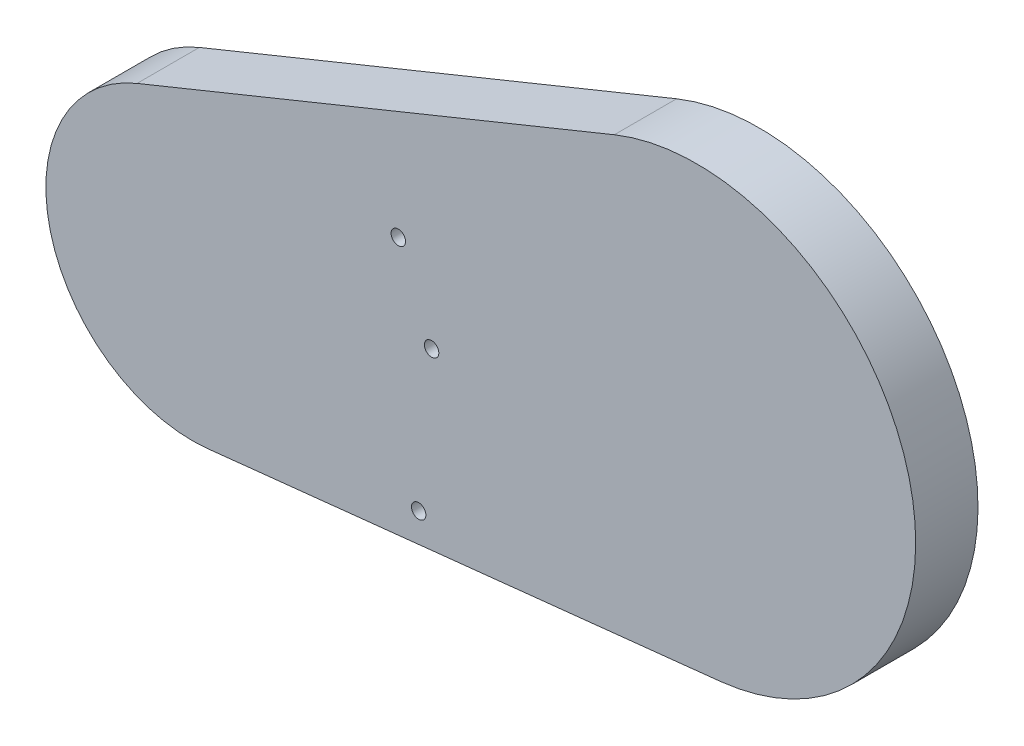
ISO-10303-21;
HEADER;
FILE_DESCRIPTION(('STEP AP214'),'2;1');
FILE_NAME('part.step','',(''),(''),'','','');
FILE_SCHEMA(('AUTOMOTIVE_DESIGN { 1 0 10303 214 1 1 1 1 }'));
ENDSEC;
DATA;
#1=APPLICATION_CONTEXT('core data for automotive mechanical design processes');
#2=APPLICATION_PROTOCOL_DEFINITION('international standard','automotive_design',2000,#1);
#3=PRODUCT_CONTEXT('',#1,'mechanical');
#4=PRODUCT('Part','Part','',(#3));
#5=PRODUCT_RELATED_PRODUCT_CATEGORY('part','',(#4));
#6=PRODUCT_DEFINITION_FORMATION('','',#4);
#7=PRODUCT_DEFINITION_CONTEXT('part definition',#1,'design');
#8=PRODUCT_DEFINITION('design','',#6,#7);
#9=PRODUCT_DEFINITION_SHAPE('','',#8);
#10=(LENGTH_UNIT() NAMED_UNIT(*) SI_UNIT(.MILLI.,.METRE.));
#11=(NAMED_UNIT(*) PLANE_ANGLE_UNIT() SI_UNIT($,.RADIAN.));
#12=(NAMED_UNIT(*) SI_UNIT($,.STERADIAN.) SOLID_ANGLE_UNIT());
#13=UNCERTAINTY_MEASURE_WITH_UNIT(LENGTH_MEASURE(1.E-05),#10,'distance_accuracy_value','');
#14=(GEOMETRIC_REPRESENTATION_CONTEXT(3) GLOBAL_UNCERTAINTY_ASSIGNED_CONTEXT((#13)) GLOBAL_UNIT_ASSIGNED_CONTEXT((#10,
#11,#12)) REPRESENTATION_CONTEXT('',''));
#15=CARTESIAN_POINT('',(0.,0.,0.));
#16=DIRECTION('',(0.,0.,1.));
#17=DIRECTION('',(1.,0.,0.));
#18=AXIS2_PLACEMENT_3D('',#15,#16,#17);
#19=CARTESIAN_POINT('',(-222.136686737355,-55.8663132626931,0.));
#20=DIRECTION('',(0.,0.,1.));
#21=DIRECTION('',(1.,0.,0.));
#22=AXIS2_PLACEMENT_3D('',#19,#20,#21);
#23=PLANE('',#22);
#24=CARTESIAN_POINT('',(-131.386504710328,2.59398918316859,0.));
#25=DIRECTION('',(0.,0.,1.));
#26=DIRECTION('',(1.,0.,0.));
#27=AXIS2_PLACEMENT_3D('',#24,#25,#26);
#28=CIRCLE('',#27,3.175);
#29=CARTESIAN_POINT('',(-128.211504710328,2.59398918316859,0.));
#30=VERTEX_POINT('',#29);
#31=EDGE_CURVE('E116',#30,#30,#28,.T.);
#32=ORIENTED_EDGE('',*,*,#31,.T.);
#33=EDGE_LOOP('',(#32));
#34=FACE_BOUND('',#33,.T.);
#35=CARTESIAN_POINT('',(-131.386504710328,2.59398918316859,0.));
#36=DIRECTION('',(0.,0.,1.));
#37=DIRECTION('',(1.,0.,0.));
#38=AXIS2_PLACEMENT_3D('',#35,#36,#37);
#39=CIRCLE('',#38,5.715);
#40=CARTESIAN_POINT('',(-125.671504710328,2.59398918316859,0.));
#41=VERTEX_POINT('',#40);
#42=EDGE_CURVE('E218',#41,#41,#39,.T.);
#43=ORIENTED_EDGE('',*,*,#42,.F.);
#44=EDGE_LOOP('',(#43));
#45=FACE_BOUND('',#44,.T.);
#46=ADVANCED_FACE('F39',(#34,#45),#23,.F.);
#47=CARTESIAN_POINT('',(-116.729233003734,-32.5753021769855,0.));
#48=DIRECTION('',(0.,0.,1.));
#49=DIRECTION('',(1.,0.,0.));
#50=AXIS2_PLACEMENT_3D('',#47,#48,#49);
#51=CIRCLE('',#50,3.17499999999997);
#52=CARTESIAN_POINT('',(-113.554233003734,-32.5753021769855,0.));
#53=VERTEX_POINT('',#52);
#54=EDGE_CURVE('E119',#53,#53,#51,.T.);
#55=ORIENTED_EDGE('',*,*,#54,.T.);
#56=EDGE_LOOP('',(#55));
#57=FACE_BOUND('',#56,.T.);
#58=CARTESIAN_POINT('',(-116.729233003734,-32.5753021769855,0.));
#59=DIRECTION('',(0.,0.,1.));
#60=DIRECTION('',(1.,0.,0.));
#61=AXIS2_PLACEMENT_3D('',#58,#59,#60);
#62=CIRCLE('',#61,5.71499999999997);
#63=CARTESIAN_POINT('',(-111.014233003734,-32.5753021769855,0.));
#64=VERTEX_POINT('',#63);
#65=EDGE_CURVE('E220',#64,#64,#62,.T.);
#66=ORIENTED_EDGE('',*,*,#65,.F.);
#67=EDGE_LOOP('',(#66));
#68=FACE_BOUND('',#67,.T.);
#69=ADVANCED_FACE('F231',(#57,#68),#23,.F.);
#70=CARTESIAN_POINT('',(-122.419021559769,-97.2134987960628,0.));
#71=DIRECTION('',(0.,0.,1.));
#72=DIRECTION('',(1.,0.,0.));
#73=AXIS2_PLACEMENT_3D('',#70,#71,#72);
#74=CIRCLE('',#73,3.17499999999997);
#75=CARTESIAN_POINT('',(-119.244021559769,-97.2134987960628,0.));
#76=VERTEX_POINT('',#75);
#77=EDGE_CURVE('E123',#76,#76,#74,.T.);
#78=ORIENTED_EDGE('',*,*,#77,.T.);
#79=EDGE_LOOP('',(#78));
#80=FACE_BOUND('',#79,.T.);
#81=CARTESIAN_POINT('',(-122.419021559769,-97.2134987960628,0.));
#82=DIRECTION('',(0.,0.,1.));
#83=DIRECTION('',(1.,0.,0.));
#84=AXIS2_PLACEMENT_3D('',#81,#82,#83);
#85=CIRCLE('',#84,5.71499999999997);
#86=CARTESIAN_POINT('',(-116.704021559769,-97.2134987960628,0.));
#87=VERTEX_POINT('',#86);
#88=EDGE_CURVE('E145',#87,#87,#85,.T.);
#89=ORIENTED_EDGE('',*,*,#88,.F.);
#90=EDGE_LOOP('',(#89));
#91=FACE_BOUND('',#90,.T.);
#92=ADVANCED_FACE('F229',(#80,#91),#23,.F.);
#93=DIRECTION('',(-0.926278440874321,-0.376839820044852,0.));
#94=VECTOR('',#93,1.);
#95=CARTESIAN_POINT('',(-245.448840445252,1.4353418209012,0.));
#96=LINE('',#95,#94);
#97=CARTESIAN_POINT('',(-35.3567786970669,86.9075402964568,0.));
#98=VERTEX_POINT('',#97);
#99=CARTESIAN_POINT('',(-245.448840445252,1.43534182090119,0.));
#100=VERTEX_POINT('',#99);
#101=EDGE_CURVE('E202',#98,#100,#96,.T.);
#102=ORIENTED_EDGE('',*,*,#101,.T.);
#103=CARTESIAN_POINT('',(-222.136686737355,-55.8663132626931,0.));
#104=DIRECTION('',(0.,0.,1.));
#105=DIRECTION('',(1.,0.,0.));
#106=AXIS2_PLACEMENT_3D('',#103,#104,#105);
#107=CIRCLE('',#106,61.8622355384919);
#108=CARTESIAN_POINT('',(-215.567656663318,-117.378783784582,0.));
#109=VERTEX_POINT('',#108);
#110=EDGE_CURVE('E193',#100,#109,#107,.T.);
#111=ORIENTED_EDGE('',*,*,#110,.T.);
#112=DIRECTION('',(0.994346065680323,0.106188048602762,0.));
#113=VECTOR('',#112,1.);
#114=CARTESIAN_POINT('',(9.96303239470388,-93.2939459220999,0.));
#115=LINE('',#114,#113);
#116=CARTESIAN_POINT('',(9.96303239470389,-93.2939459220999,0.));
#117=VERTEX_POINT('',#116);
#118=EDGE_CURVE('E187',#109,#117,#115,.T.);
#119=ORIENTED_EDGE('',*,*,#118,.T.);
#120=CARTESIAN_POINT('',(0.,0.,0.));
#121=DIRECTION('',(0.,0.,1.));
#122=DIRECTION('',(1.,0.,0.));
#123=AXIS2_PLACEMENT_3D('',#120,#121,#122);
#124=CIRCLE('',#123,93.8244230475926);
#125=EDGE_CURVE('E56',#117,#98,#124,.T.);
#126=ORIENTED_EDGE('',*,*,#125,.T.);
#127=EDGE_LOOP('',(#102,#111,#119,#126));
#128=FACE_BOUND('',#127,.T.);
#129=CARTESIAN_POINT('',(-222.136686737355,-55.8663132626931,0.));
#130=DIRECTION('',(0.,0.,1.));
#131=DIRECTION('',(1.,0.,0.));
#132=AXIS2_PLACEMENT_3D('',#129,#130,#131);
#133=CIRCLE('',#132,64.4022355384919);
#134=CARTESIAN_POINT('',(-246.406013588166,3.78808906072198,0.));
#135=VERTEX_POINT('',#134);
#136=CARTESIAN_POINT('',(-215.297939019867,-119.90442279141,0.));
#137=VERTEX_POINT('',#136);
#138=EDGE_CURVE('E102',#135,#137,#133,.T.);
#139=ORIENTED_EDGE('',*,*,#138,.F.);
#140=DIRECTION('',(-0.926278440874321,-0.376839820044852,0.));
#141=VECTOR('',#140,1.);
#142=CARTESIAN_POINT('',(-246.406013588166,3.78808906072198,0.));
#143=LINE('',#142,#141);
#144=CARTESIAN_POINT('',(-36.3139518399808,89.2602875362775,0.));
#145=VERTEX_POINT('',#144);
#146=EDGE_CURVE('E129',#145,#135,#143,.T.);
#147=ORIENTED_EDGE('',*,*,#146,.F.);
#148=CARTESIAN_POINT('',(0.,0.,0.));
#149=DIRECTION('',(0.,0.,1.));
#150=DIRECTION('',(1.,0.,0.));
#151=AXIS2_PLACEMENT_3D('',#148,#149,#150);
#152=CIRCLE('',#151,96.3644230475926);
#153=CARTESIAN_POINT('',(10.2327500381549,-95.8195849289279,0.));
#154=VERTEX_POINT('',#153);
#155=EDGE_CURVE('E104',#154,#145,#152,.T.);
#156=ORIENTED_EDGE('',*,*,#155,.F.);
#157=DIRECTION('',(0.994346065680323,0.106188048602762,0.));
#158=VECTOR('',#157,1.);
#159=CARTESIAN_POINT('',(10.2327500381549,-95.8195849289279,0.));
#160=LINE('',#159,#158);
#161=EDGE_CURVE('E92',#137,#154,#160,.T.);
#162=ORIENTED_EDGE('',*,*,#161,.F.);
#163=EDGE_LOOP('',(#139,#147,#156,#162));
#164=FACE_BOUND('',#163,.T.);
#165=ADVANCED_FACE('F100',(#128,#164),#23,.F.);
#166=CARTESIAN_POINT('',(-222.136686737355,-55.8663132626931,480.07228683974));
#167=DIRECTION('',(0.,0.,-1.));
#168=DIRECTION('',(-1.,0.,0.));
#169=AXIS2_PLACEMENT_3D('',#166,#167,#168);
#170=CYLINDRICAL_SURFACE('',#169,64.4022355384919);
#171=DIRECTION('',(0.,0.,-1.));
#172=VECTOR('',#171,1.);
#173=CARTESIAN_POINT('',(-215.297939019867,-119.90442279141,480.07228683974));
#174=LINE('',#173,#172);
#175=CARTESIAN_POINT('',(-215.297939019867,-119.90442279141,27.4349999999975));
#176=VERTEX_POINT('',#175);
#177=EDGE_CURVE('E88',#176,#137,#174,.T.);
#178=ORIENTED_EDGE('',*,*,#177,.F.);
#179=CARTESIAN_POINT('',(-222.136686737355,-55.8663132626931,27.4349999999975));
#180=DIRECTION('',(0.,0.,-1.));
#181=DIRECTION('',(-1.,0.,0.));
#182=AXIS2_PLACEMENT_3D('',#179,#180,#181);
#183=CIRCLE('',#182,64.4022355384919);
#184=CARTESIAN_POINT('',(-246.406013588166,3.78808906072198,27.4349999999975));
#185=VERTEX_POINT('',#184);
#186=EDGE_CURVE('E65',#176,#185,#183,.T.);
#187=ORIENTED_EDGE('',*,*,#186,.T.);
#188=DIRECTION('',(0.,0.,-1.));
#189=VECTOR('',#188,1.);
#190=CARTESIAN_POINT('',(-246.406013588166,3.78808906072198,480.07228683974));
#191=LINE('',#190,#189);
#192=EDGE_CURVE('E109',#185,#135,#191,.T.);
#193=ORIENTED_EDGE('',*,*,#192,.T.);
#194=ORIENTED_EDGE('',*,*,#138,.T.);
#195=EDGE_LOOP('',(#178,#187,#193,#194));
#196=FACE_BOUND('',#195,.T.);
#197=ADVANCED_FACE('F107',(#196),#170,.T.);
#198=CARTESIAN_POINT('',(10.2327500381549,-95.8195849289279,480.07228683974));
#199=DIRECTION('',(-0.106188048602762,0.994346065680323,0.));
#200=DIRECTION('',(-0.994346065680323,-0.106188048602762,0.));
#201=AXIS2_PLACEMENT_3D('',#198,#199,#200);
#202=PLANE('',#201);
#203=DIRECTION('',(0.,0.,-1.));
#204=VECTOR('',#203,1.);
#205=CARTESIAN_POINT('',(10.2327500381549,-95.8195849289279,480.07228683974));
#206=LINE('',#205,#204);
#207=CARTESIAN_POINT('',(10.2327500381549,-95.8195849289279,27.4349999999975));
#208=VERTEX_POINT('',#207);
#209=EDGE_CURVE('E126',#208,#154,#206,.T.);
#210=ORIENTED_EDGE('',*,*,#209,.F.);
#211=DIRECTION('',(-0.994346065680323,-0.106188048602762,0.));
#212=VECTOR('',#211,1.);
#213=CARTESIAN_POINT('',(10.2327500381549,-95.8195849289279,27.4349999999975));
#214=LINE('',#213,#212);
#215=EDGE_CURVE('E94',#208,#176,#214,.T.);
#216=ORIENTED_EDGE('',*,*,#215,.T.);
#217=ORIENTED_EDGE('',*,*,#177,.T.);
#218=ORIENTED_EDGE('',*,*,#161,.T.);
#219=EDGE_LOOP('',(#210,#216,#217,#218));
#220=FACE_BOUND('',#219,.T.);
#221=ADVANCED_FACE('F91',(#220),#202,.F.);
#222=CARTESIAN_POINT('',(0.,0.,480.07228683974));
#223=DIRECTION('',(0.,0.,-1.));
#224=DIRECTION('',(-1.,0.,0.));
#225=AXIS2_PLACEMENT_3D('',#222,#223,#224);
#226=CYLINDRICAL_SURFACE('',#225,96.3644230475926);
#227=DIRECTION('',(0.,0.,-1.));
#228=VECTOR('',#227,1.);
#229=CARTESIAN_POINT('',(-36.3139518399808,89.2602875362775,480.07228683974));
#230=LINE('',#229,#228);
#231=CARTESIAN_POINT('',(-36.3139518399808,89.2602875362775,27.4349999999975));
#232=VERTEX_POINT('',#231);
#233=EDGE_CURVE('E128',#232,#145,#230,.T.);
#234=ORIENTED_EDGE('',*,*,#233,.F.);
#235=CARTESIAN_POINT('',(0.,0.,27.4349999999975));
#236=DIRECTION('',(0.,0.,-1.));
#237=DIRECTION('',(-1.,0.,0.));
#238=AXIS2_PLACEMENT_3D('',#235,#236,#237);
#239=CIRCLE('',#238,96.3644230475926);
#240=EDGE_CURVE('E105',#232,#208,#239,.T.);
#241=ORIENTED_EDGE('',*,*,#240,.T.);
#242=ORIENTED_EDGE('',*,*,#209,.T.);
#243=ORIENTED_EDGE('',*,*,#155,.T.);
#244=EDGE_LOOP('',(#234,#241,#242,#243));
#245=FACE_BOUND('',#244,.T.);
#246=ADVANCED_FACE('F149',(#245),#226,.T.);
#247=CARTESIAN_POINT('',(-246.406013588166,3.78808906072198,480.07228683974));
#248=DIRECTION('',(0.376839820044852,-0.926278440874321,0.));
#249=DIRECTION('',(0.926278440874321,0.376839820044852,0.));
#250=AXIS2_PLACEMENT_3D('',#247,#248,#249);
#251=PLANE('',#250);
#252=ORIENTED_EDGE('',*,*,#192,.F.);
#253=DIRECTION('',(0.926278440874321,0.376839820044852,0.));
#254=VECTOR('',#253,1.);
#255=CARTESIAN_POINT('',(-246.406013588166,3.78808906072198,27.4349999999975));
#256=LINE('',#255,#254);
#257=EDGE_CURVE('E130',#185,#232,#256,.T.);
#258=ORIENTED_EDGE('',*,*,#257,.T.);
#259=ORIENTED_EDGE('',*,*,#233,.T.);
#260=ORIENTED_EDGE('',*,*,#146,.T.);
#261=EDGE_LOOP('',(#252,#258,#259,#260));
#262=FACE_BOUND('',#261,.T.);
#263=ADVANCED_FACE('F371',(#262),#251,.F.);
#264=CARTESIAN_POINT('',(-131.386504710328,2.59398918316859,480.07228683974));
#265=DIRECTION('',(0.,0.,-1.));
#266=DIRECTION('',(-1.,0.,0.));
#267=AXIS2_PLACEMENT_3D('',#264,#265,#266);
#268=CYLINDRICAL_SURFACE('',#267,3.175);
#269=CARTESIAN_POINT('',(-131.386504710328,2.59398918316859,27.4349999999975));
#270=DIRECTION('',(0.,0.,-1.));
#271=DIRECTION('',(-1.,0.,0.));
#272=AXIS2_PLACEMENT_3D('',#269,#270,#271);
#273=CIRCLE('',#272,3.175);
#274=CARTESIAN_POINT('',(-134.561504710328,2.59398918316859,27.4349999999975));
#275=VERTEX_POINT('',#274);
#276=EDGE_CURVE('E11',#275,#275,#273,.T.);
#277=ORIENTED_EDGE('',*,*,#276,.F.);
#278=EDGE_LOOP('',(#277));
#279=FACE_BOUND('',#278,.T.);
#280=ORIENTED_EDGE('',*,*,#31,.F.);
#281=EDGE_LOOP('',(#280));
#282=FACE_BOUND('',#281,.T.);
#283=ADVANCED_FACE('F361',(#279,#282),#268,.F.);
#284=CARTESIAN_POINT('',(-116.729233003734,-32.5753021769855,480.07228683974));
#285=DIRECTION('',(0.,0.,-1.));
#286=DIRECTION('',(-1.,0.,0.));
#287=AXIS2_PLACEMENT_3D('',#284,#285,#286);
#288=CYLINDRICAL_SURFACE('',#287,3.17499999999997);
#289=CARTESIAN_POINT('',(-116.729233003734,-32.5753021769855,27.4349999999975));
#290=DIRECTION('',(0.,0.,-1.));
#291=DIRECTION('',(-1.,0.,0.));
#292=AXIS2_PLACEMENT_3D('',#289,#290,#291);
#293=CIRCLE('',#292,3.17499999999997);
#294=CARTESIAN_POINT('',(-119.904233003734,-32.5753021769855,27.4349999999975));
#295=VERTEX_POINT('',#294);
#296=EDGE_CURVE('E48',#295,#295,#293,.T.);
#297=ORIENTED_EDGE('',*,*,#296,.F.);
#298=EDGE_LOOP('',(#297));
#299=FACE_BOUND('',#298,.T.);
#300=ORIENTED_EDGE('',*,*,#54,.F.);
#301=EDGE_LOOP('',(#300));
#302=FACE_BOUND('',#301,.T.);
#303=ADVANCED_FACE('F352',(#299,#302),#288,.F.);
#304=CARTESIAN_POINT('',(-122.419021559769,-97.2134987960628,480.07228683974));
#305=DIRECTION('',(0.,0.,-1.));
#306=DIRECTION('',(-1.,0.,0.));
#307=AXIS2_PLACEMENT_3D('',#304,#305,#306);
#308=CYLINDRICAL_SURFACE('',#307,3.17499999999997);
#309=CARTESIAN_POINT('',(-122.419021559769,-97.2134987960628,27.4349999999975));
#310=DIRECTION('',(0.,0.,-1.));
#311=DIRECTION('',(-1.,0.,0.));
#312=AXIS2_PLACEMENT_3D('',#309,#310,#311);
#313=CIRCLE('',#312,3.17499999999997);
#314=CARTESIAN_POINT('',(-125.594021559769,-97.2134987960628,27.4349999999975));
#315=VERTEX_POINT('',#314);
#316=EDGE_CURVE('E43',#315,#315,#313,.T.);
#317=ORIENTED_EDGE('',*,*,#316,.F.);
#318=EDGE_LOOP('',(#317));
#319=FACE_BOUND('',#318,.T.);
#320=ORIENTED_EDGE('',*,*,#77,.F.);
#321=EDGE_LOOP('',(#320));
#322=FACE_BOUND('',#321,.T.);
#323=ADVANCED_FACE('F344',(#319,#322),#308,.F.);
#324=CARTESIAN_POINT('',(0.,0.,27.4349999999976));
#325=DIRECTION('',(0.,0.,-1.));
#326=DIRECTION('',(-1.,0.,0.));
#327=AXIS2_PLACEMENT_3D('',#324,#325,#326);
#328=PLANE('',#327);
#329=ORIENTED_EDGE('',*,*,#316,.T.);
#330=EDGE_LOOP('',(#329));
#331=FACE_BOUND('',#330,.T.);
#332=ORIENTED_EDGE('',*,*,#296,.T.);
#333=EDGE_LOOP('',(#332));
#334=FACE_BOUND('',#333,.T.);
#335=ORIENTED_EDGE('',*,*,#276,.T.);
#336=EDGE_LOOP('',(#335));
#337=FACE_BOUND('',#336,.T.);
#338=ORIENTED_EDGE('',*,*,#215,.F.);
#339=ORIENTED_EDGE('',*,*,#240,.F.);
#340=ORIENTED_EDGE('',*,*,#257,.F.);
#341=ORIENTED_EDGE('',*,*,#186,.F.);
#342=EDGE_LOOP('',(#338,#339,#340,#341));
#343=FACE_BOUND('',#342,.T.);
#344=ADVANCED_FACE('F41',(#331,#334,#337,#343),#328,.F.);
#345=CARTESIAN_POINT('',(-222.136686737355,-55.8663132626931,480.07228683974));
#346=DIRECTION('',(0.,0.,-1.));
#347=DIRECTION('',(-1.,0.,0.));
#348=AXIS2_PLACEMENT_3D('',#345,#346,#347);
#349=CYLINDRICAL_SURFACE('',#348,61.8622355384919);
#350=DIRECTION('',(0.,0.,1.));
#351=VECTOR('',#350,1.);
#352=CARTESIAN_POINT('',(-215.567656663318,-117.378783784582,480.07228683974));
#353=LINE('',#352,#351);
#354=CARTESIAN_POINT('',(-215.567656663318,-117.378783784582,24.8949999999976));
#355=VERTEX_POINT('',#354);
#356=EDGE_CURVE('E176',#355,#109,#353,.F.);
#357=ORIENTED_EDGE('',*,*,#356,.T.);
#358=ORIENTED_EDGE('',*,*,#110,.F.);
#359=DIRECTION('',(0.,0.,-1.));
#360=VECTOR('',#359,1.);
#361=CARTESIAN_POINT('',(-245.448840445252,1.43534182090119,480.07228683974));
#362=LINE('',#361,#360);
#363=CARTESIAN_POINT('',(-245.448840445252,1.43534182090119,24.8949999999976));
#364=VERTEX_POINT('',#363);
#365=EDGE_CURVE('E178',#364,#100,#362,.T.);
#366=ORIENTED_EDGE('',*,*,#365,.F.);
#367=CARTESIAN_POINT('',(-222.136686737355,-55.8663132626931,24.8949999999976));
#368=DIRECTION('',(0.,0.,-1.));
#369=DIRECTION('',(-1.,0.,0.));
#370=AXIS2_PLACEMENT_3D('',#367,#368,#369);
#371=CIRCLE('',#370,61.8622355384919);
#372=EDGE_CURVE('E172',#355,#364,#371,.T.);
#373=ORIENTED_EDGE('',*,*,#372,.F.);
#374=EDGE_LOOP('',(#357,#358,#366,#373));
#375=FACE_BOUND('',#374,.T.);
#376=ADVANCED_FACE('F174',(#375),#349,.F.);
#377=CARTESIAN_POINT('',(9.96303239470388,-93.2939459220999,480.07228683974));
#378=DIRECTION('',(-0.106188048602762,0.994346065680323,0.));
#379=DIRECTION('',(-0.994346065680323,-0.106188048602762,0.));
#380=AXIS2_PLACEMENT_3D('',#377,#378,#379);
#381=PLANE('',#380);
#382=DIRECTION('',(0.,0.,-1.));
#383=VECTOR('',#382,1.);
#384=CARTESIAN_POINT('',(9.96303239470389,-93.2939459220999,480.07228683974));
#385=LINE('',#384,#383);
#386=CARTESIAN_POINT('',(9.96303239470389,-93.2939459220999,24.8949999999976));
#387=VERTEX_POINT('',#386);
#388=EDGE_CURVE('E198',#387,#117,#385,.T.);
#389=ORIENTED_EDGE('',*,*,#388,.T.);
#390=ORIENTED_EDGE('',*,*,#118,.F.);
#391=ORIENTED_EDGE('',*,*,#356,.F.);
#392=DIRECTION('',(-0.994346065680323,-0.106188048602762,0.));
#393=VECTOR('',#392,1.);
#394=CARTESIAN_POINT('',(9.96303239470388,-93.2939459220999,24.8949999999976));
#395=LINE('',#394,#393);
#396=EDGE_CURVE('E185',#387,#355,#395,.T.);
#397=ORIENTED_EDGE('',*,*,#396,.F.);
#398=EDGE_LOOP('',(#389,#390,#391,#397));
#399=FACE_BOUND('',#398,.T.);
#400=ADVANCED_FACE('F184',(#399),#381,.T.);
#401=CARTESIAN_POINT('',(0.,0.,480.07228683974));
#402=DIRECTION('',(0.,0.,-1.));
#403=DIRECTION('',(-1.,0.,0.));
#404=AXIS2_PLACEMENT_3D('',#401,#402,#403);
#405=CYLINDRICAL_SURFACE('',#404,93.8244230475926);
#406=DIRECTION('',(0.,0.,1.));
#407=VECTOR('',#406,1.);
#408=CARTESIAN_POINT('',(-35.3567786970669,86.9075402964568,480.07228683974));
#409=LINE('',#408,#407);
#410=CARTESIAN_POINT('',(-35.3567786970669,86.9075402964568,24.8949999999976));
#411=VERTEX_POINT('',#410);
#412=EDGE_CURVE('E200',#411,#98,#409,.F.);
#413=ORIENTED_EDGE('',*,*,#412,.T.);
#414=ORIENTED_EDGE('',*,*,#125,.F.);
#415=ORIENTED_EDGE('',*,*,#388,.F.);
#416=CARTESIAN_POINT('',(0.,0.,24.8949999999976));
#417=DIRECTION('',(0.,0.,-1.));
#418=DIRECTION('',(-1.,0.,0.));
#419=AXIS2_PLACEMENT_3D('',#416,#417,#418);
#420=CIRCLE('',#419,93.8244230475926);
#421=EDGE_CURVE('E192',#411,#387,#420,.T.);
#422=ORIENTED_EDGE('',*,*,#421,.F.);
#423=EDGE_LOOP('',(#413,#414,#415,#422));
#424=FACE_BOUND('',#423,.T.);
#425=ADVANCED_FACE('F263',(#424),#405,.F.);
#426=CARTESIAN_POINT('',(-245.448840445252,1.4353418209012,480.07228683974));
#427=DIRECTION('',(0.376839820044852,-0.926278440874321,0.));
#428=DIRECTION('',(0.926278440874321,0.376839820044852,0.));
#429=AXIS2_PLACEMENT_3D('',#426,#427,#428);
#430=PLANE('',#429);
#431=ORIENTED_EDGE('',*,*,#365,.T.);
#432=ORIENTED_EDGE('',*,*,#101,.F.);
#433=ORIENTED_EDGE('',*,*,#412,.F.);
#434=DIRECTION('',(0.926278440874321,0.376839820044852,0.));
#435=VECTOR('',#434,1.);
#436=CARTESIAN_POINT('',(-245.448840445252,1.4353418209012,24.8949999999976));
#437=LINE('',#436,#435);
#438=EDGE_CURVE('E203',#364,#411,#437,.T.);
#439=ORIENTED_EDGE('',*,*,#438,.F.);
#440=EDGE_LOOP('',(#431,#432,#433,#439));
#441=FACE_BOUND('',#440,.T.);
#442=ADVANCED_FACE('F254',(#441),#430,.T.);
#443=CARTESIAN_POINT('',(-131.386504710328,2.59398918316859,480.07228683974));
#444=DIRECTION('',(0.,0.,-1.));
#445=DIRECTION('',(-1.,0.,0.));
#446=AXIS2_PLACEMENT_3D('',#443,#444,#445);
#447=CYLINDRICAL_SURFACE('',#446,5.715);
#448=CARTESIAN_POINT('',(-131.386504710328,2.59398918316859,24.8949999999976));
#449=DIRECTION('',(0.,0.,-1.));
#450=DIRECTION('',(-1.,0.,0.));
#451=AXIS2_PLACEMENT_3D('',#448,#449,#450);
#452=CIRCLE('',#451,5.715);
#453=CARTESIAN_POINT('',(-137.101504710328,2.59398918316859,24.8949999999976));
#454=VERTEX_POINT('',#453);
#455=EDGE_CURVE('E120',#454,#454,#452,.T.);
#456=ORIENTED_EDGE('',*,*,#455,.T.);
#457=EDGE_LOOP('',(#456));
#458=FACE_BOUND('',#457,.T.);
#459=ORIENTED_EDGE('',*,*,#42,.T.);
#460=EDGE_LOOP('',(#459));
#461=FACE_BOUND('',#460,.T.);
#462=ADVANCED_FACE('F251',(#458,#461),#447,.T.);
#463=CARTESIAN_POINT('',(-116.729233003734,-32.5753021769855,480.07228683974));
#464=DIRECTION('',(0.,0.,-1.));
#465=DIRECTION('',(-1.,0.,0.));
#466=AXIS2_PLACEMENT_3D('',#463,#464,#465);
#467=CYLINDRICAL_SURFACE('',#466,5.71499999999997);
#468=CARTESIAN_POINT('',(-116.729233003734,-32.5753021769855,24.8949999999976));
#469=DIRECTION('',(0.,0.,-1.));
#470=DIRECTION('',(-1.,0.,0.));
#471=AXIS2_PLACEMENT_3D('',#468,#469,#470);
#472=CIRCLE('',#471,5.71499999999997);
#473=CARTESIAN_POINT('',(-122.444233003734,-32.5753021769855,24.8949999999976));
#474=VERTEX_POINT('',#473);
#475=EDGE_CURVE('E209',#474,#474,#472,.T.);
#476=ORIENTED_EDGE('',*,*,#475,.T.);
#477=EDGE_LOOP('',(#476));
#478=FACE_BOUND('',#477,.T.);
#479=ORIENTED_EDGE('',*,*,#65,.T.);
#480=EDGE_LOOP('',(#479));
#481=FACE_BOUND('',#480,.T.);
#482=ADVANCED_FACE('F253',(#478,#481),#467,.T.);
#483=CARTESIAN_POINT('',(-122.419021559769,-97.2134987960628,480.07228683974));
#484=DIRECTION('',(0.,0.,-1.));
#485=DIRECTION('',(-1.,0.,0.));
#486=AXIS2_PLACEMENT_3D('',#483,#484,#485);
#487=CYLINDRICAL_SURFACE('',#486,5.71499999999997);
#488=CARTESIAN_POINT('',(-122.419021559769,-97.2134987960628,24.8949999999976));
#489=DIRECTION('',(0.,0.,-1.));
#490=DIRECTION('',(-1.,0.,0.));
#491=AXIS2_PLACEMENT_3D('',#488,#489,#490);
#492=CIRCLE('',#491,5.71499999999997);
#493=CARTESIAN_POINT('',(-128.134021559769,-97.2134987960628,24.8949999999976));
#494=VERTEX_POINT('',#493);
#495=EDGE_CURVE('E206',#494,#494,#492,.T.);
#496=ORIENTED_EDGE('',*,*,#495,.T.);
#497=EDGE_LOOP('',(#496));
#498=FACE_BOUND('',#497,.T.);
#499=ORIENTED_EDGE('',*,*,#88,.T.);
#500=EDGE_LOOP('',(#499));
#501=FACE_BOUND('',#500,.T.);
#502=ADVANCED_FACE('F227',(#498,#501),#487,.T.);
#503=CARTESIAN_POINT('',(0.,0.,24.8949999999976));
#504=DIRECTION('',(0.,0.,-1.));
#505=DIRECTION('',(-1.,0.,0.));
#506=AXIS2_PLACEMENT_3D('',#503,#504,#505);
#507=PLANE('',#506);
#508=ORIENTED_EDGE('',*,*,#495,.F.);
#509=EDGE_LOOP('',(#508));
#510=FACE_BOUND('',#509,.T.);
#511=ORIENTED_EDGE('',*,*,#475,.F.);
#512=EDGE_LOOP('',(#511));
#513=FACE_BOUND('',#512,.T.);
#514=ORIENTED_EDGE('',*,*,#455,.F.);
#515=EDGE_LOOP('',(#514));
#516=FACE_BOUND('',#515,.T.);
#517=ORIENTED_EDGE('',*,*,#396,.T.);
#518=ORIENTED_EDGE('',*,*,#372,.T.);
#519=ORIENTED_EDGE('',*,*,#438,.T.);
#520=ORIENTED_EDGE('',*,*,#421,.T.);
#521=EDGE_LOOP('',(#517,#518,#519,#520));
#522=FACE_BOUND('',#521,.T.);
#523=ADVANCED_FACE('F191',(#510,#513,#516,#522),#507,.T.);
#524=CLOSED_SHELL('',(#46,#69,#92,#165,#197,#221,#246,#263,#283,#303,#323,#344,#376,#400,#425,
#442,#462,#482,#502,#523));
#525=MANIFOLD_SOLID_BREP('B2',#524);
#526=ADVANCED_BREP_SHAPE_REPRESENTATION('',(#18,#525),#14);
#527=SHAPE_DEFINITION_REPRESENTATION(#9,#526);
ENDSEC;
END-ISO-10303-21;
